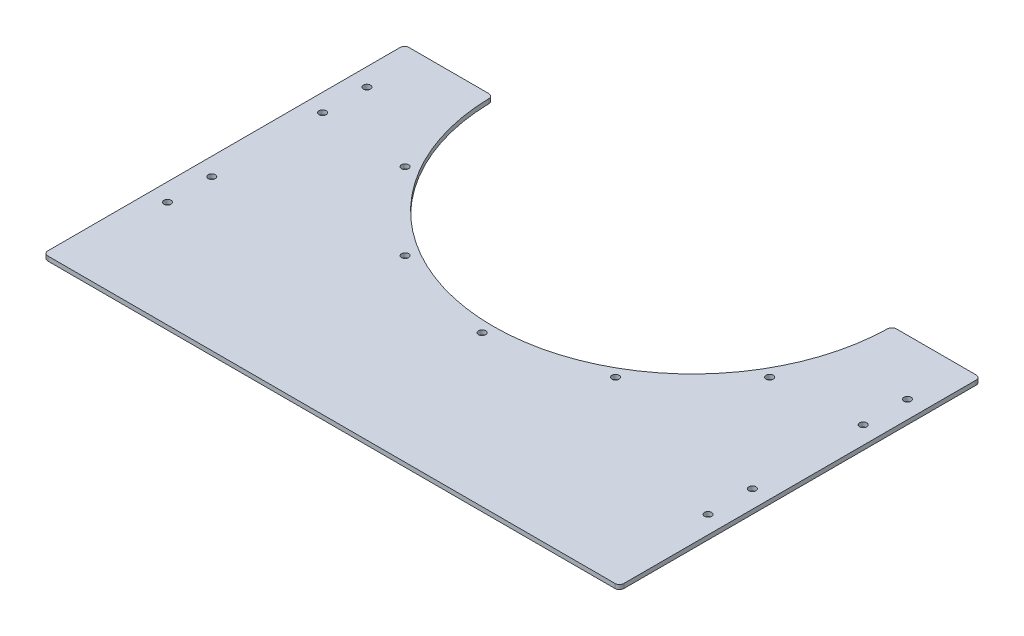
ISO-10303-21;
HEADER;
FILE_DESCRIPTION(('STEP AP214'),'2;1');
FILE_NAME('part.step','',(''),(''),'','','');
FILE_SCHEMA(('AUTOMOTIVE_DESIGN { 1 0 10303 214 1 1 1 1 }'));
ENDSEC;
DATA;
#1=APPLICATION_CONTEXT('core data for automotive mechanical design processes');
#2=APPLICATION_PROTOCOL_DEFINITION('international standard','automotive_design',2000,#1);
#3=PRODUCT_CONTEXT('',#1,'mechanical');
#4=PRODUCT('Part','Part','',(#3));
#5=PRODUCT_RELATED_PRODUCT_CATEGORY('part','',(#4));
#6=PRODUCT_DEFINITION_FORMATION('','',#4);
#7=PRODUCT_DEFINITION_CONTEXT('part definition',#1,'design');
#8=PRODUCT_DEFINITION('design','',#6,#7);
#9=PRODUCT_DEFINITION_SHAPE('','',#8);
#10=(LENGTH_UNIT() NAMED_UNIT(*) SI_UNIT(.MILLI.,.METRE.));
#11=(NAMED_UNIT(*) PLANE_ANGLE_UNIT() SI_UNIT($,.RADIAN.));
#12=(NAMED_UNIT(*) SI_UNIT($,.STERADIAN.) SOLID_ANGLE_UNIT());
#13=UNCERTAINTY_MEASURE_WITH_UNIT(LENGTH_MEASURE(1.E-05),#10,'distance_accuracy_value','');
#14=(GEOMETRIC_REPRESENTATION_CONTEXT(3) GLOBAL_UNCERTAINTY_ASSIGNED_CONTEXT((#13)) GLOBAL_UNIT_ASSIGNED_CONTEXT((#10,
#11,#12)) REPRESENTATION_CONTEXT('',''));
#15=CARTESIAN_POINT('',(0.,0.,0.));
#16=DIRECTION('',(0.,0.,1.));
#17=DIRECTION('',(1.,0.,0.));
#18=AXIS2_PLACEMENT_3D('',#15,#16,#17);
#19=CARTESIAN_POINT('',(0.,2.,-81.5000000000001));
#20=DIRECTION('',(0.,-1.,0.));
#21=DIRECTION('',(0.,0.,-1.));
#22=AXIS2_PLACEMENT_3D('',#19,#20,#21);
#23=CYLINDRICAL_SURFACE('',#22,90.);
#24=CARTESIAN_POINT('',(0.,2.,-81.5000000000001));
#25=DIRECTION('',(0.,1.,0.));
#26=DIRECTION('',(0.,0.,1.));
#27=AXIS2_PLACEMENT_3D('',#24,#25,#26);
#28=CIRCLE('',#27,90.);
#29=CARTESIAN_POINT('',(-89.9787309461759,2.,-79.5434782608696));
#30=VERTEX_POINT('',#29);
#31=CARTESIAN_POINT('',(89.9787309461759,2.,-79.5434782608696));
#32=VERTEX_POINT('',#31);
#33=EDGE_CURVE('E212',#30,#32,#28,.T.);
#34=ORIENTED_EDGE('',*,*,#33,.T.);
#35=DIRECTION('',(0.,-1.,0.));
#36=VECTOR('',#35,1.);
#37=CARTESIAN_POINT('',(89.9787309461759,2.,-79.5434782608696));
#38=LINE('',#37,#36);
#39=CARTESIAN_POINT('',(89.9787309461759,0.,-79.5434782608696));
#40=VERTEX_POINT('',#39);
#41=EDGE_CURVE('E146',#32,#40,#38,.T.);
#42=ORIENTED_EDGE('',*,*,#41,.T.);
#43=CARTESIAN_POINT('',(0.,0.,-81.5000000000001));
#44=DIRECTION('',(0.,1.,0.));
#45=DIRECTION('',(0.,0.,1.));
#46=AXIS2_PLACEMENT_3D('',#43,#44,#45);
#47=CIRCLE('',#46,90.);
#48=CARTESIAN_POINT('',(-89.9787309461759,0.,-79.5434782608696));
#49=VERTEX_POINT('',#48);
#50=EDGE_CURVE('E131',#49,#40,#47,.T.);
#51=ORIENTED_EDGE('',*,*,#50,.F.);
#52=DIRECTION('',(0.,-1.,0.));
#53=VECTOR('',#52,1.);
#54=CARTESIAN_POINT('',(-89.9787309461759,2.,-79.5434782608696));
#55=LINE('',#54,#53);
#56=EDGE_CURVE('E143',#49,#30,#55,.F.);
#57=ORIENTED_EDGE('',*,*,#56,.T.);
#58=EDGE_LOOP('',(#34,#42,#51,#57));
#59=FACE_BOUND('',#58,.T.);
#60=ADVANCED_FACE('F36',(#59),#23,.F.);
#61=CARTESIAN_POINT('',(0.,2.,-81.5));
#62=DIRECTION('',(0.,0.,1.));
#63=DIRECTION('',(1.,0.,0.));
#64=AXIS2_PLACEMENT_3D('',#61,#62,#63);
#65=PLANE('',#64);
#66=DIRECTION('',(-1.,0.,0.));
#67=VECTOR('',#66,1.);
#68=CARTESIAN_POINT('',(0.,2.,-81.5));
#69=LINE('',#68,#67);
#70=CARTESIAN_POINT('',(-91.9782583005354,2.,-81.5));
#71=VERTEX_POINT('',#70);
#72=CARTESIAN_POINT('',(-128.,2.,-81.5));
#73=VERTEX_POINT('',#72);
#74=EDGE_CURVE('E203',#71,#73,#69,.T.);
#75=ORIENTED_EDGE('',*,*,#74,.F.);
#76=DIRECTION('',(0.,1.,0.));
#77=VECTOR('',#76,1.);
#78=CARTESIAN_POINT('',(-91.9782583005354,0.,-81.5));
#79=LINE('',#78,#77);
#80=CARTESIAN_POINT('',(-91.9782583005354,0.,-81.5));
#81=VERTEX_POINT('',#80);
#82=EDGE_CURVE('E11',#71,#81,#79,.F.);
#83=ORIENTED_EDGE('',*,*,#82,.T.);
#84=DIRECTION('',(-1.,0.,0.));
#85=VECTOR('',#84,1.);
#86=CARTESIAN_POINT('',(0.,0.,-81.5));
#87=LINE('',#86,#85);
#88=CARTESIAN_POINT('',(-128.,0.,-81.5));
#89=VERTEX_POINT('',#88);
#90=EDGE_CURVE('E133',#81,#89,#87,.T.);
#91=ORIENTED_EDGE('',*,*,#90,.T.);
#92=DIRECTION('',(0.,-1.,0.));
#93=VECTOR('',#92,1.);
#94=CARTESIAN_POINT('',(-128.,2.,-81.5));
#95=LINE('',#94,#93);
#96=EDGE_CURVE('E44',#89,#73,#95,.F.);
#97=ORIENTED_EDGE('',*,*,#96,.T.);
#98=EDGE_LOOP('',(#75,#83,#91,#97));
#99=FACE_BOUND('',#98,.T.);
#100=ADVANCED_FACE('F202',(#99),#65,.F.);
#101=CARTESIAN_POINT('',(-130.,2.,0.));
#102=DIRECTION('',(-1.,0.,0.));
#103=DIRECTION('',(0.,0.,1.));
#104=AXIS2_PLACEMENT_3D('',#101,#102,#103);
#105=PLANE('',#104);
#106=DIRECTION('',(0.,0.,-1.));
#107=VECTOR('',#106,1.);
#108=CARTESIAN_POINT('',(-130.,0.,0.));
#109=LINE('',#108,#107);
#110=CARTESIAN_POINT('',(-130.,0.,79.5));
#111=VERTEX_POINT('',#110);
#112=CARTESIAN_POINT('',(-130.,0.,-79.5));
#113=VERTEX_POINT('',#112);
#114=EDGE_CURVE('E220',#111,#113,#109,.T.);
#115=ORIENTED_EDGE('',*,*,#114,.F.);
#116=DIRECTION('',(0.,-1.,0.));
#117=VECTOR('',#116,1.);
#118=CARTESIAN_POINT('',(-130.,2.,79.5));
#119=LINE('',#118,#117);
#120=CARTESIAN_POINT('',(-130.,2.,79.5));
#121=VERTEX_POINT('',#120);
#122=EDGE_CURVE('E197',#111,#121,#119,.F.);
#123=ORIENTED_EDGE('',*,*,#122,.T.);
#124=DIRECTION('',(0.,0.,-1.));
#125=VECTOR('',#124,1.);
#126=CARTESIAN_POINT('',(-130.,2.,0.));
#127=LINE('',#126,#125);
#128=CARTESIAN_POINT('',(-130.,2.,-79.5));
#129=VERTEX_POINT('',#128);
#130=EDGE_CURVE('E211',#121,#129,#127,.T.);
#131=ORIENTED_EDGE('',*,*,#130,.T.);
#132=DIRECTION('',(0.,-1.,0.));
#133=VECTOR('',#132,1.);
#134=CARTESIAN_POINT('',(-130.,0.,-79.5));
#135=LINE('',#134,#133);
#136=EDGE_CURVE('E194',#129,#113,#135,.T.);
#137=ORIENTED_EDGE('',*,*,#136,.T.);
#138=EDGE_LOOP('',(#115,#123,#131,#137));
#139=FACE_BOUND('',#138,.T.);
#140=ADVANCED_FACE('F219',(#139),#105,.T.);
#141=CARTESIAN_POINT('',(0.,2.,81.5));
#142=DIRECTION('',(0.,0.,1.));
#143=DIRECTION('',(1.,0.,0.));
#144=AXIS2_PLACEMENT_3D('',#141,#142,#143);
#145=PLANE('',#144);
#146=DIRECTION('',(-1.,0.,0.));
#147=VECTOR('',#146,1.);
#148=CARTESIAN_POINT('',(0.,0.,81.5));
#149=LINE('',#148,#147);
#150=CARTESIAN_POINT('',(128.,0.,81.5));
#151=VERTEX_POINT('',#150);
#152=CARTESIAN_POINT('',(-128.,0.,81.5));
#153=VERTEX_POINT('',#152);
#154=EDGE_CURVE('E223',#151,#153,#149,.T.);
#155=ORIENTED_EDGE('',*,*,#154,.F.);
#156=DIRECTION('',(0.,-1.,0.));
#157=VECTOR('',#156,1.);
#158=CARTESIAN_POINT('',(128.,2.,81.5));
#159=LINE('',#158,#157);
#160=CARTESIAN_POINT('',(128.,2.,81.5));
#161=VERTEX_POINT('',#160);
#162=EDGE_CURVE('E192',#151,#161,#159,.F.);
#163=ORIENTED_EDGE('',*,*,#162,.T.);
#164=DIRECTION('',(-1.,0.,0.));
#165=VECTOR('',#164,1.);
#166=CARTESIAN_POINT('',(0.,2.,81.5));
#167=LINE('',#166,#165);
#168=CARTESIAN_POINT('',(-128.,2.,81.5));
#169=VERTEX_POINT('',#168);
#170=EDGE_CURVE('E254',#161,#169,#167,.T.);
#171=ORIENTED_EDGE('',*,*,#170,.T.);
#172=DIRECTION('',(0.,-1.,0.));
#173=VECTOR('',#172,1.);
#174=CARTESIAN_POINT('',(-128.,2.,81.5));
#175=LINE('',#174,#173);
#176=EDGE_CURVE('E189',#169,#153,#175,.T.);
#177=ORIENTED_EDGE('',*,*,#176,.T.);
#178=EDGE_LOOP('',(#155,#163,#171,#177));
#179=FACE_BOUND('',#178,.T.);
#180=ADVANCED_FACE('F317',(#179),#145,.T.);
#181=CARTESIAN_POINT('',(130.,2.,0.));
#182=DIRECTION('',(-1.,0.,0.));
#183=DIRECTION('',(0.,0.,1.));
#184=AXIS2_PLACEMENT_3D('',#181,#182,#183);
#185=PLANE('',#184);
#186=DIRECTION('',(0.,0.,-1.));
#187=VECTOR('',#186,1.);
#188=CARTESIAN_POINT('',(130.,0.,0.));
#189=LINE('',#188,#187);
#190=CARTESIAN_POINT('',(130.,0.,79.5));
#191=VERTEX_POINT('',#190);
#192=CARTESIAN_POINT('',(130.,0.,-79.5));
#193=VERTEX_POINT('',#192);
#194=EDGE_CURVE('E225',#191,#193,#189,.T.);
#195=ORIENTED_EDGE('',*,*,#194,.T.);
#196=DIRECTION('',(0.,-1.,0.));
#197=VECTOR('',#196,1.);
#198=CARTESIAN_POINT('',(130.,2.,-79.5));
#199=LINE('',#198,#197);
#200=CARTESIAN_POINT('',(130.,2.,-79.5));
#201=VERTEX_POINT('',#200);
#202=EDGE_CURVE('E51',#193,#201,#199,.F.);
#203=ORIENTED_EDGE('',*,*,#202,.T.);
#204=DIRECTION('',(0.,0.,-1.));
#205=VECTOR('',#204,1.);
#206=CARTESIAN_POINT('',(130.,2.,0.));
#207=LINE('',#206,#205);
#208=CARTESIAN_POINT('',(130.,2.,79.5));
#209=VERTEX_POINT('',#208);
#210=EDGE_CURVE('E257',#209,#201,#207,.T.);
#211=ORIENTED_EDGE('',*,*,#210,.F.);
#212=DIRECTION('',(0.,-1.,0.));
#213=VECTOR('',#212,1.);
#214=CARTESIAN_POINT('',(130.,0.,79.5));
#215=LINE('',#214,#213);
#216=EDGE_CURVE('E185',#209,#191,#215,.T.);
#217=ORIENTED_EDGE('',*,*,#216,.T.);
#218=EDGE_LOOP('',(#195,#203,#211,#217));
#219=FACE_BOUND('',#218,.T.);
#220=ADVANCED_FACE('F320',(#219),#185,.F.);
#221=CARTESIAN_POINT('',(122.,2.,13.5));
#222=DIRECTION('',(0.,-1.,0.));
#223=DIRECTION('',(0.,0.,-1.));
#224=AXIS2_PLACEMENT_3D('',#221,#222,#223);
#225=CYLINDRICAL_SURFACE('',#224,1.6);
#226=CARTESIAN_POINT('',(122.,2.,13.5));
#227=DIRECTION('',(0.,1.,0.));
#228=DIRECTION('',(0.,0.,1.));
#229=AXIS2_PLACEMENT_3D('',#226,#227,#228);
#230=CIRCLE('',#229,1.6);
#231=CARTESIAN_POINT('',(122.,2.,15.1));
#232=VERTEX_POINT('',#231);
#233=EDGE_CURVE('E156',#232,#232,#230,.F.);
#234=ORIENTED_EDGE('',*,*,#233,.F.);
#235=EDGE_LOOP('',(#234));
#236=FACE_BOUND('',#235,.T.);
#237=CARTESIAN_POINT('',(122.,0.,13.5));
#238=DIRECTION('',(0.,1.,0.));
#239=DIRECTION('',(0.,0.,1.));
#240=AXIS2_PLACEMENT_3D('',#237,#238,#239);
#241=CIRCLE('',#240,1.6);
#242=CARTESIAN_POINT('',(122.,0.,15.1));
#243=VERTEX_POINT('',#242);
#244=EDGE_CURVE('E230',#243,#243,#241,.F.);
#245=ORIENTED_EDGE('',*,*,#244,.T.);
#246=EDGE_LOOP('',(#245));
#247=FACE_BOUND('',#246,.T.);
#248=ADVANCED_FACE('F307',(#236,#247),#225,.F.);
#249=CARTESIAN_POINT('',(128.,0.,-81.5));
#250=VERTEX_POINT('',#249);
#251=CARTESIAN_POINT('',(91.9782583005354,0.,-81.5));
#252=VERTEX_POINT('',#251);
#253=EDGE_CURVE('E228',#250,#252,#87,.T.);
#254=ORIENTED_EDGE('',*,*,#253,.T.);
#255=DIRECTION('',(0.,1.,0.));
#256=VECTOR('',#255,1.);
#257=CARTESIAN_POINT('',(91.9782583005354,2.,-81.5));
#258=LINE('',#257,#256);
#259=CARTESIAN_POINT('',(91.9782583005354,2.,-81.5));
#260=VERTEX_POINT('',#259);
#261=EDGE_CURVE('E173',#252,#260,#258,.T.);
#262=ORIENTED_EDGE('',*,*,#261,.T.);
#263=CARTESIAN_POINT('',(128.,2.,-81.5));
#264=VERTEX_POINT('',#263);
#265=EDGE_CURVE('E214',#264,#260,#69,.T.);
#266=ORIENTED_EDGE('',*,*,#265,.F.);
#267=DIRECTION('',(0.,-1.,0.));
#268=VECTOR('',#267,1.);
#269=CARTESIAN_POINT('',(128.,2.,-81.5));
#270=LINE('',#269,#268);
#271=EDGE_CURVE('E170',#264,#250,#270,.T.);
#272=ORIENTED_EDGE('',*,*,#271,.T.);
#273=EDGE_LOOP('',(#254,#262,#266,#272));
#274=FACE_BOUND('',#273,.T.);
#275=ADVANCED_FACE('F240',(#274),#65,.F.);
#276=CARTESIAN_POINT('',(-122.,2.,33.5));
#277=DIRECTION('',(0.,-1.,0.));
#278=DIRECTION('',(0.,0.,-1.));
#279=AXIS2_PLACEMENT_3D('',#276,#277,#278);
#280=CYLINDRICAL_SURFACE('',#279,1.60000000000001);
#281=CARTESIAN_POINT('',(-122.,2.,33.5));
#282=DIRECTION('',(0.,1.,0.));
#283=DIRECTION('',(0.,0.,1.));
#284=AXIS2_PLACEMENT_3D('',#281,#282,#283);
#285=CIRCLE('',#284,1.60000000000001);
#286=CARTESIAN_POINT('',(-122.,2.,35.1));
#287=VERTEX_POINT('',#286);
#288=EDGE_CURVE('E246',#287,#287,#285,.T.);
#289=ORIENTED_EDGE('',*,*,#288,.T.);
#290=EDGE_LOOP('',(#289));
#291=FACE_BOUND('',#290,.T.);
#292=CARTESIAN_POINT('',(-122.,0.,33.5));
#293=DIRECTION('',(0.,1.,0.));
#294=DIRECTION('',(0.,0.,1.));
#295=AXIS2_PLACEMENT_3D('',#292,#293,#294);
#296=CIRCLE('',#295,1.60000000000001);
#297=CARTESIAN_POINT('',(-122.,0.,35.1));
#298=VERTEX_POINT('',#297);
#299=EDGE_CURVE('E147',#298,#298,#296,.T.);
#300=ORIENTED_EDGE('',*,*,#299,.F.);
#301=EDGE_LOOP('',(#300));
#302=FACE_BOUND('',#301,.T.);
#303=ADVANCED_FACE('F295',(#291,#302),#280,.F.);
#304=CARTESIAN_POINT('',(-122.,2.,13.5));
#305=DIRECTION('',(0.,-1.,0.));
#306=DIRECTION('',(0.,0.,-1.));
#307=AXIS2_PLACEMENT_3D('',#304,#305,#306);
#308=CYLINDRICAL_SURFACE('',#307,1.6);
#309=CARTESIAN_POINT('',(-122.,2.,13.5));
#310=DIRECTION('',(0.,1.,0.));
#311=DIRECTION('',(0.,0.,1.));
#312=AXIS2_PLACEMENT_3D('',#309,#310,#311);
#313=CIRCLE('',#312,1.6);
#314=CARTESIAN_POINT('',(-122.,2.,15.1));
#315=VERTEX_POINT('',#314);
#316=EDGE_CURVE('E249',#315,#315,#313,.T.);
#317=ORIENTED_EDGE('',*,*,#316,.T.);
#318=EDGE_LOOP('',(#317));
#319=FACE_BOUND('',#318,.T.);
#320=CARTESIAN_POINT('',(-122.,0.,13.5));
#321=DIRECTION('',(0.,1.,0.));
#322=DIRECTION('',(0.,0.,1.));
#323=AXIS2_PLACEMENT_3D('',#320,#321,#322);
#324=CIRCLE('',#323,1.6);
#325=CARTESIAN_POINT('',(-122.,0.,15.1));
#326=VERTEX_POINT('',#325);
#327=EDGE_CURVE('E288',#326,#326,#324,.T.);
#328=ORIENTED_EDGE('',*,*,#327,.F.);
#329=EDGE_LOOP('',(#328));
#330=FACE_BOUND('',#329,.T.);
#331=ADVANCED_FACE('F297',(#319,#330),#308,.F.);
#332=CARTESIAN_POINT('',(-122.,2.,-36.5));
#333=DIRECTION('',(0.,-1.,0.));
#334=DIRECTION('',(0.,0.,-1.));
#335=AXIS2_PLACEMENT_3D('',#332,#333,#334);
#336=CYLINDRICAL_SURFACE('',#335,1.60000000000001);
#337=CARTESIAN_POINT('',(-122.,2.,-36.5));
#338=DIRECTION('',(0.,1.,0.));
#339=DIRECTION('',(0.,0.,1.));
#340=AXIS2_PLACEMENT_3D('',#337,#338,#339);
#341=CIRCLE('',#340,1.60000000000001);
#342=CARTESIAN_POINT('',(-122.,2.,-34.9));
#343=VERTEX_POINT('',#342);
#344=EDGE_CURVE('E373',#343,#343,#341,.T.);
#345=ORIENTED_EDGE('',*,*,#344,.T.);
#346=EDGE_LOOP('',(#345));
#347=FACE_BOUND('',#346,.T.);
#348=CARTESIAN_POINT('',(-122.,0.,-36.5));
#349=DIRECTION('',(0.,1.,0.));
#350=DIRECTION('',(0.,0.,1.));
#351=AXIS2_PLACEMENT_3D('',#348,#349,#350);
#352=CIRCLE('',#351,1.60000000000001);
#353=CARTESIAN_POINT('',(-122.,0.,-34.9));
#354=VERTEX_POINT('',#353);
#355=EDGE_CURVE('E285',#354,#354,#352,.T.);
#356=ORIENTED_EDGE('',*,*,#355,.F.);
#357=EDGE_LOOP('',(#356));
#358=FACE_BOUND('',#357,.T.);
#359=ADVANCED_FACE('F304',(#347,#358),#336,.F.);
#360=CARTESIAN_POINT('',(-122.,2.,-56.5));
#361=DIRECTION('',(0.,-1.,0.));
#362=DIRECTION('',(0.,0.,-1.));
#363=AXIS2_PLACEMENT_3D('',#360,#361,#362);
#364=CYLINDRICAL_SURFACE('',#363,1.60000000000001);
#365=CARTESIAN_POINT('',(-122.,2.,-56.5));
#366=DIRECTION('',(0.,1.,0.));
#367=DIRECTION('',(0.,0.,1.));
#368=AXIS2_PLACEMENT_3D('',#365,#366,#367);
#369=CIRCLE('',#368,1.60000000000001);
#370=CARTESIAN_POINT('',(-122.,2.,-54.9));
#371=VERTEX_POINT('',#370);
#372=EDGE_CURVE('E369',#371,#371,#369,.T.);
#373=ORIENTED_EDGE('',*,*,#372,.T.);
#374=EDGE_LOOP('',(#373));
#375=FACE_BOUND('',#374,.T.);
#376=CARTESIAN_POINT('',(-122.,0.,-56.5));
#377=DIRECTION('',(0.,1.,0.));
#378=DIRECTION('',(0.,0.,1.));
#379=AXIS2_PLACEMENT_3D('',#376,#377,#378);
#380=CIRCLE('',#379,1.60000000000001);
#381=CARTESIAN_POINT('',(-122.,0.,-54.9));
#382=VERTEX_POINT('',#381);
#383=EDGE_CURVE('E282',#382,#382,#380,.T.);
#384=ORIENTED_EDGE('',*,*,#383,.F.);
#385=EDGE_LOOP('',(#384));
#386=FACE_BOUND('',#385,.T.);
#387=ADVANCED_FACE('F414',(#375,#386),#364,.F.);
#388=CARTESIAN_POINT('',(122.,2.,33.5));
#389=DIRECTION('',(0.,-1.,0.));
#390=DIRECTION('',(0.,0.,-1.));
#391=AXIS2_PLACEMENT_3D('',#388,#389,#390);
#392=CYLINDRICAL_SURFACE('',#391,1.60000000000001);
#393=CARTESIAN_POINT('',(122.,2.,33.5));
#394=DIRECTION('',(0.,1.,0.));
#395=DIRECTION('',(0.,0.,1.));
#396=AXIS2_PLACEMENT_3D('',#393,#394,#395);
#397=CIRCLE('',#396,1.60000000000001);
#398=CARTESIAN_POINT('',(122.,2.,35.1));
#399=VERTEX_POINT('',#398);
#400=EDGE_CURVE('E365',#399,#399,#397,.F.);
#401=ORIENTED_EDGE('',*,*,#400,.F.);
#402=EDGE_LOOP('',(#401));
#403=FACE_BOUND('',#402,.T.);
#404=CARTESIAN_POINT('',(122.,0.,33.5));
#405=DIRECTION('',(0.,1.,0.));
#406=DIRECTION('',(0.,0.,1.));
#407=AXIS2_PLACEMENT_3D('',#404,#405,#406);
#408=CIRCLE('',#407,1.60000000000001);
#409=CARTESIAN_POINT('',(122.,0.,35.1));
#410=VERTEX_POINT('',#409);
#411=EDGE_CURVE('E279',#410,#410,#408,.F.);
#412=ORIENTED_EDGE('',*,*,#411,.T.);
#413=EDGE_LOOP('',(#412));
#414=FACE_BOUND('',#413,.T.);
#415=ADVANCED_FACE('F420',(#403,#414),#392,.F.);
#416=CARTESIAN_POINT('',(122.,2.,-36.5));
#417=DIRECTION('',(0.,-1.,0.));
#418=DIRECTION('',(0.,0.,-1.));
#419=AXIS2_PLACEMENT_3D('',#416,#417,#418);
#420=CYLINDRICAL_SURFACE('',#419,1.60000000000001);
#421=CARTESIAN_POINT('',(122.,2.,-36.5));
#422=DIRECTION('',(0.,1.,0.));
#423=DIRECTION('',(0.,0.,1.));
#424=AXIS2_PLACEMENT_3D('',#421,#422,#423);
#425=CIRCLE('',#424,1.60000000000001);
#426=CARTESIAN_POINT('',(122.,2.,-34.9));
#427=VERTEX_POINT('',#426);
#428=EDGE_CURVE('E361',#427,#427,#425,.F.);
#429=ORIENTED_EDGE('',*,*,#428,.F.);
#430=EDGE_LOOP('',(#429));
#431=FACE_BOUND('',#430,.T.);
#432=CARTESIAN_POINT('',(122.,0.,-36.5));
#433=DIRECTION('',(0.,1.,0.));
#434=DIRECTION('',(0.,0.,1.));
#435=AXIS2_PLACEMENT_3D('',#432,#433,#434);
#436=CIRCLE('',#435,1.60000000000001);
#437=CARTESIAN_POINT('',(122.,0.,-34.9));
#438=VERTEX_POINT('',#437);
#439=EDGE_CURVE('E276',#438,#438,#436,.F.);
#440=ORIENTED_EDGE('',*,*,#439,.T.);
#441=EDGE_LOOP('',(#440));
#442=FACE_BOUND('',#441,.T.);
#443=ADVANCED_FACE('F426',(#431,#442),#420,.F.);
#444=CARTESIAN_POINT('',(82.2724133595255,2.,-34.000000000002));
#445=DIRECTION('',(0.,-1.,0.));
#446=DIRECTION('',(0.,0.,-1.));
#447=AXIS2_PLACEMENT_3D('',#444,#445,#446);
#448=CYLINDRICAL_SURFACE('',#447,1.6);
#449=CARTESIAN_POINT('',(82.2724133595255,2.,-34.000000000002));
#450=DIRECTION('',(0.,1.,0.));
#451=DIRECTION('',(0.,0.,1.));
#452=AXIS2_PLACEMENT_3D('',#449,#450,#451);
#453=CIRCLE('',#452,1.6);
#454=CARTESIAN_POINT('',(82.2724133595255,2.,-32.400000000002));
#455=VERTEX_POINT('',#454);
#456=EDGE_CURVE('E357',#455,#455,#453,.T.);
#457=ORIENTED_EDGE('',*,*,#456,.T.);
#458=EDGE_LOOP('',(#457));
#459=FACE_BOUND('',#458,.T.);
#460=CARTESIAN_POINT('',(82.2724133595255,0.,-34.000000000002));
#461=DIRECTION('',(0.,1.,0.));
#462=DIRECTION('',(0.,0.,1.));
#463=AXIS2_PLACEMENT_3D('',#460,#461,#462);
#464=CIRCLE('',#463,1.6);
#465=CARTESIAN_POINT('',(82.2724133595255,0.,-32.400000000002));
#466=VERTEX_POINT('',#465);
#467=EDGE_CURVE('E273',#466,#466,#464,.T.);
#468=ORIENTED_EDGE('',*,*,#467,.F.);
#469=EDGE_LOOP('',(#468));
#470=FACE_BOUND('',#469,.T.);
#471=ADVANCED_FACE('F430',(#459,#470),#448,.F.);
#472=CARTESIAN_POINT('',(47.5000000000046,2.,0.772413359520524));
#473=DIRECTION('',(0.,-1.,0.));
#474=DIRECTION('',(0.,0.,-1.));
#475=AXIS2_PLACEMENT_3D('',#472,#473,#474);
#476=CYLINDRICAL_SURFACE('',#475,1.60000000000002);
#477=CARTESIAN_POINT('',(47.5000000000046,2.,0.772413359520524));
#478=DIRECTION('',(0.,1.,0.));
#479=DIRECTION('',(0.,0.,1.));
#480=AXIS2_PLACEMENT_3D('',#477,#478,#479);
#481=CIRCLE('',#480,1.60000000000002);
#482=CARTESIAN_POINT('',(47.5000000000046,2.,2.37241335952055));
#483=VERTEX_POINT('',#482);
#484=EDGE_CURVE('E353',#483,#483,#481,.T.);
#485=ORIENTED_EDGE('',*,*,#484,.T.);
#486=EDGE_LOOP('',(#485));
#487=FACE_BOUND('',#486,.T.);
#488=CARTESIAN_POINT('',(47.5000000000046,0.,0.772413359520524));
#489=DIRECTION('',(0.,1.,0.));
#490=DIRECTION('',(0.,0.,1.));
#491=AXIS2_PLACEMENT_3D('',#488,#489,#490);
#492=CIRCLE('',#491,1.60000000000002);
#493=CARTESIAN_POINT('',(47.5000000000046,0.,2.37241335952055));
#494=VERTEX_POINT('',#493);
#495=EDGE_CURVE('E270',#494,#494,#492,.T.);
#496=ORIENTED_EDGE('',*,*,#495,.F.);
#497=EDGE_LOOP('',(#496));
#498=FACE_BOUND('',#497,.T.);
#499=ADVANCED_FACE('F434',(#487,#498),#476,.F.);
#500=CARTESIAN_POINT('',(4.7009792771229E-12,2.,13.5));
#501=DIRECTION('',(0.,-1.,0.));
#502=DIRECTION('',(0.,0.,-1.));
#503=AXIS2_PLACEMENT_3D('',#500,#501,#502);
#504=CYLINDRICAL_SURFACE('',#503,1.6);
#505=CARTESIAN_POINT('',(4.7009792771229E-12,2.,13.5));
#506=DIRECTION('',(0.,1.,0.));
#507=DIRECTION('',(0.,0.,1.));
#508=AXIS2_PLACEMENT_3D('',#505,#506,#507);
#509=CIRCLE('',#508,1.6);
#510=CARTESIAN_POINT('',(4.7009792771229E-12,2.,15.1));
#511=VERTEX_POINT('',#510);
#512=EDGE_CURVE('E349',#511,#511,#509,.T.);
#513=ORIENTED_EDGE('',*,*,#512,.T.);
#514=EDGE_LOOP('',(#513));
#515=FACE_BOUND('',#514,.T.);
#516=CARTESIAN_POINT('',(4.7009792771229E-12,0.,13.5));
#517=DIRECTION('',(0.,1.,0.));
#518=DIRECTION('',(0.,0.,1.));
#519=AXIS2_PLACEMENT_3D('',#516,#517,#518);
#520=CIRCLE('',#519,1.6);
#521=CARTESIAN_POINT('',(4.7009792771229E-12,0.,15.1));
#522=VERTEX_POINT('',#521);
#523=EDGE_CURVE('E267',#522,#522,#520,.T.);
#524=ORIENTED_EDGE('',*,*,#523,.F.);
#525=EDGE_LOOP('',(#524));
#526=FACE_BOUND('',#525,.T.);
#527=ADVANCED_FACE('F438',(#515,#526),#504,.F.);
#528=CARTESIAN_POINT('',(-47.4999999999957,2.,0.772413359522578));
#529=DIRECTION('',(0.,-1.,0.));
#530=DIRECTION('',(0.,0.,-1.));
#531=AXIS2_PLACEMENT_3D('',#528,#529,#530);
#532=CYLINDRICAL_SURFACE('',#531,1.6);
#533=CARTESIAN_POINT('',(-47.4999999999957,2.,0.772413359522578));
#534=DIRECTION('',(0.,1.,0.));
#535=DIRECTION('',(0.,0.,1.));
#536=AXIS2_PLACEMENT_3D('',#533,#534,#535);
#537=CIRCLE('',#536,1.6);
#538=CARTESIAN_POINT('',(-47.4999999999957,2.,2.37241335952258));
#539=VERTEX_POINT('',#538);
#540=EDGE_CURVE('E345',#539,#539,#537,.T.);
#541=ORIENTED_EDGE('',*,*,#540,.T.);
#542=EDGE_LOOP('',(#541));
#543=FACE_BOUND('',#542,.T.);
#544=CARTESIAN_POINT('',(-47.4999999999957,0.,0.772413359522578));
#545=DIRECTION('',(0.,1.,0.));
#546=DIRECTION('',(0.,0.,1.));
#547=AXIS2_PLACEMENT_3D('',#544,#545,#546);
#548=CIRCLE('',#547,1.6);
#549=CARTESIAN_POINT('',(-47.4999999999957,0.,2.37241335952258));
#550=VERTEX_POINT('',#549);
#551=EDGE_CURVE('E264',#550,#550,#548,.T.);
#552=ORIENTED_EDGE('',*,*,#551,.F.);
#553=EDGE_LOOP('',(#552));
#554=FACE_BOUND('',#553,.T.);
#555=ADVANCED_FACE('F390',(#543,#554),#532,.F.);
#556=CARTESIAN_POINT('',(-82.2724133595181,2.,-33.9999999999985));
#557=DIRECTION('',(0.,-1.,0.));
#558=DIRECTION('',(0.,0.,-1.));
#559=AXIS2_PLACEMENT_3D('',#556,#557,#558);
#560=CYLINDRICAL_SURFACE('',#559,1.59999999999999);
#561=CARTESIAN_POINT('',(-82.2724133595181,2.,-33.9999999999985));
#562=DIRECTION('',(0.,1.,0.));
#563=DIRECTION('',(0.,0.,1.));
#564=AXIS2_PLACEMENT_3D('',#561,#562,#563);
#565=CIRCLE('',#564,1.59999999999999);
#566=CARTESIAN_POINT('',(-82.2724133595181,2.,-32.3999999999985));
#567=VERTEX_POINT('',#566);
#568=EDGE_CURVE('E235',#567,#567,#565,.T.);
#569=ORIENTED_EDGE('',*,*,#568,.T.);
#570=EDGE_LOOP('',(#569));
#571=FACE_BOUND('',#570,.T.);
#572=CARTESIAN_POINT('',(-82.2724133595181,0.,-33.9999999999985));
#573=DIRECTION('',(0.,1.,0.));
#574=DIRECTION('',(0.,0.,1.));
#575=AXIS2_PLACEMENT_3D('',#572,#573,#574);
#576=CIRCLE('',#575,1.59999999999999);
#577=CARTESIAN_POINT('',(-82.2724133595181,0.,-32.3999999999985));
#578=VERTEX_POINT('',#577);
#579=EDGE_CURVE('E261',#578,#578,#576,.T.);
#580=ORIENTED_EDGE('',*,*,#579,.F.);
#581=EDGE_LOOP('',(#580));
#582=FACE_BOUND('',#581,.T.);
#583=ADVANCED_FACE('F330',(#571,#582),#560,.F.);
#584=CARTESIAN_POINT('',(122.,2.,-56.5));
#585=DIRECTION('',(0.,-1.,0.));
#586=DIRECTION('',(0.,0.,-1.));
#587=AXIS2_PLACEMENT_3D('',#584,#585,#586);
#588=CYLINDRICAL_SURFACE('',#587,1.60000000000001);
#589=CARTESIAN_POINT('',(122.,2.,-56.5));
#590=DIRECTION('',(0.,1.,0.));
#591=DIRECTION('',(0.,0.,1.));
#592=AXIS2_PLACEMENT_3D('',#589,#590,#591);
#593=CIRCLE('',#592,1.60000000000001);
#594=CARTESIAN_POINT('',(122.,2.,-54.9));
#595=VERTEX_POINT('',#594);
#596=EDGE_CURVE('E152',#595,#595,#593,.F.);
#597=ORIENTED_EDGE('',*,*,#596,.F.);
#598=EDGE_LOOP('',(#597));
#599=FACE_BOUND('',#598,.T.);
#600=CARTESIAN_POINT('',(122.,0.,-56.5));
#601=DIRECTION('',(0.,1.,0.));
#602=DIRECTION('',(0.,0.,1.));
#603=AXIS2_PLACEMENT_3D('',#600,#601,#602);
#604=CIRCLE('',#603,1.60000000000001);
#605=CARTESIAN_POINT('',(122.,0.,-54.9));
#606=VERTEX_POINT('',#605);
#607=EDGE_CURVE('E159',#606,#606,#604,.F.);
#608=ORIENTED_EDGE('',*,*,#607,.T.);
#609=EDGE_LOOP('',(#608));
#610=FACE_BOUND('',#609,.T.);
#611=ADVANCED_FACE('F327',(#599,#610),#588,.F.);
#612=CARTESIAN_POINT('',(0.,2.,0.));
#613=DIRECTION('',(0.,1.,0.));
#614=DIRECTION('',(0.,0.,1.));
#615=AXIS2_PLACEMENT_3D('',#612,#613,#614);
#616=PLANE('',#615);
#617=ORIENTED_EDGE('',*,*,#568,.F.);
#618=EDGE_LOOP('',(#617));
#619=FACE_BOUND('',#618,.T.);
#620=ORIENTED_EDGE('',*,*,#540,.F.);
#621=EDGE_LOOP('',(#620));
#622=FACE_BOUND('',#621,.T.);
#623=ORIENTED_EDGE('',*,*,#512,.F.);
#624=EDGE_LOOP('',(#623));
#625=FACE_BOUND('',#624,.T.);
#626=ORIENTED_EDGE('',*,*,#484,.F.);
#627=EDGE_LOOP('',(#626));
#628=FACE_BOUND('',#627,.T.);
#629=ORIENTED_EDGE('',*,*,#456,.F.);
#630=EDGE_LOOP('',(#629));
#631=FACE_BOUND('',#630,.T.);
#632=ORIENTED_EDGE('',*,*,#428,.T.);
#633=EDGE_LOOP('',(#632));
#634=FACE_BOUND('',#633,.T.);
#635=ORIENTED_EDGE('',*,*,#400,.T.);
#636=EDGE_LOOP('',(#635));
#637=FACE_BOUND('',#636,.T.);
#638=ORIENTED_EDGE('',*,*,#372,.F.);
#639=EDGE_LOOP('',(#638));
#640=FACE_BOUND('',#639,.T.);
#641=ORIENTED_EDGE('',*,*,#344,.F.);
#642=EDGE_LOOP('',(#641));
#643=FACE_BOUND('',#642,.T.);
#644=ORIENTED_EDGE('',*,*,#316,.F.);
#645=EDGE_LOOP('',(#644));
#646=FACE_BOUND('',#645,.T.);
#647=ORIENTED_EDGE('',*,*,#288,.F.);
#648=EDGE_LOOP('',(#647));
#649=FACE_BOUND('',#648,.T.);
#650=ORIENTED_EDGE('',*,*,#265,.T.);
#651=CARTESIAN_POINT('',(91.9782583005354,2.,-79.5));
#652=DIRECTION('',(0.,1.,0.));
#653=DIRECTION('',(0.,0.,1.));
#654=AXIS2_PLACEMENT_3D('',#651,#652,#653);
#655=CIRCLE('',#654,2.);
#656=EDGE_CURVE('E183',#260,#32,#655,.T.);
#657=ORIENTED_EDGE('',*,*,#656,.T.);
#658=ORIENTED_EDGE('',*,*,#33,.F.);
#659=CARTESIAN_POINT('',(-91.9782583005354,2.,-79.5));
#660=DIRECTION('',(0.,1.,0.));
#661=DIRECTION('',(0.,0.,1.));
#662=AXIS2_PLACEMENT_3D('',#659,#660,#661);
#663=CIRCLE('',#662,2.);
#664=EDGE_CURVE('E151',#30,#71,#663,.T.);
#665=ORIENTED_EDGE('',*,*,#664,.T.);
#666=ORIENTED_EDGE('',*,*,#74,.T.);
#667=CARTESIAN_POINT('',(-128.,2.,-79.5));
#668=DIRECTION('',(0.,1.,0.));
#669=DIRECTION('',(0.,0.,1.));
#670=AXIS2_PLACEMENT_3D('',#667,#668,#669);
#671=CIRCLE('',#670,2.);
#672=EDGE_CURVE('E175',#73,#129,#671,.T.);
#673=ORIENTED_EDGE('',*,*,#672,.T.);
#674=ORIENTED_EDGE('',*,*,#130,.F.);
#675=CARTESIAN_POINT('',(-128.,2.,79.5));
#676=DIRECTION('',(0.,1.,0.));
#677=DIRECTION('',(0.,0.,1.));
#678=AXIS2_PLACEMENT_3D('',#675,#676,#677);
#679=CIRCLE('',#678,2.);
#680=EDGE_CURVE('E178',#121,#169,#679,.T.);
#681=ORIENTED_EDGE('',*,*,#680,.T.);
#682=ORIENTED_EDGE('',*,*,#170,.F.);
#683=CARTESIAN_POINT('',(128.,2.,79.5));
#684=DIRECTION('',(0.,1.,0.));
#685=DIRECTION('',(0.,0.,1.));
#686=AXIS2_PLACEMENT_3D('',#683,#684,#685);
#687=CIRCLE('',#686,2.);
#688=EDGE_CURVE('E58',#161,#209,#687,.T.);
#689=ORIENTED_EDGE('',*,*,#688,.T.);
#690=ORIENTED_EDGE('',*,*,#210,.T.);
#691=CARTESIAN_POINT('',(128.,2.,-79.5));
#692=DIRECTION('',(0.,1.,0.));
#693=DIRECTION('',(0.,0.,1.));
#694=AXIS2_PLACEMENT_3D('',#691,#692,#693);
#695=CIRCLE('',#694,2.);
#696=EDGE_CURVE('E181',#201,#264,#695,.T.);
#697=ORIENTED_EDGE('',*,*,#696,.T.);
#698=EDGE_LOOP('',(#650,#657,#658,#665,#666,#673,#674,#681,#682,#689,#690,#697));
#699=FACE_BOUND('',#698,.T.);
#700=ORIENTED_EDGE('',*,*,#233,.T.);
#701=EDGE_LOOP('',(#700));
#702=FACE_BOUND('',#701,.T.);
#703=ORIENTED_EDGE('',*,*,#596,.T.);
#704=EDGE_LOOP('',(#703));
#705=FACE_BOUND('',#704,.T.);
#706=ADVANCED_FACE('F207',(#619,#622,#625,#628,#631,#634,#637,#640,#643,#646,#649,#699,#702,
#705),#616,.T.);
#707=CARTESIAN_POINT('',(0.,0.,0.));
#708=DIRECTION('',(0.,1.,0.));
#709=DIRECTION('',(0.,0.,1.));
#710=AXIS2_PLACEMENT_3D('',#707,#708,#709);
#711=PLANE('',#710);
#712=ORIENTED_EDGE('',*,*,#579,.T.);
#713=EDGE_LOOP('',(#712));
#714=FACE_BOUND('',#713,.T.);
#715=ORIENTED_EDGE('',*,*,#551,.T.);
#716=EDGE_LOOP('',(#715));
#717=FACE_BOUND('',#716,.T.);
#718=ORIENTED_EDGE('',*,*,#523,.T.);
#719=EDGE_LOOP('',(#718));
#720=FACE_BOUND('',#719,.T.);
#721=ORIENTED_EDGE('',*,*,#495,.T.);
#722=EDGE_LOOP('',(#721));
#723=FACE_BOUND('',#722,.T.);
#724=ORIENTED_EDGE('',*,*,#467,.T.);
#725=EDGE_LOOP('',(#724));
#726=FACE_BOUND('',#725,.T.);
#727=ORIENTED_EDGE('',*,*,#439,.F.);
#728=EDGE_LOOP('',(#727));
#729=FACE_BOUND('',#728,.T.);
#730=ORIENTED_EDGE('',*,*,#411,.F.);
#731=EDGE_LOOP('',(#730));
#732=FACE_BOUND('',#731,.T.);
#733=ORIENTED_EDGE('',*,*,#383,.T.);
#734=EDGE_LOOP('',(#733));
#735=FACE_BOUND('',#734,.T.);
#736=ORIENTED_EDGE('',*,*,#355,.T.);
#737=EDGE_LOOP('',(#736));
#738=FACE_BOUND('',#737,.T.);
#739=ORIENTED_EDGE('',*,*,#327,.T.);
#740=EDGE_LOOP('',(#739));
#741=FACE_BOUND('',#740,.T.);
#742=ORIENTED_EDGE('',*,*,#299,.T.);
#743=EDGE_LOOP('',(#742));
#744=FACE_BOUND('',#743,.T.);
#745=ORIENTED_EDGE('',*,*,#50,.T.);
#746=CARTESIAN_POINT('',(91.9782583005354,0.,-79.5));
#747=DIRECTION('',(0.,1.,0.));
#748=DIRECTION('',(0.,0.,1.));
#749=AXIS2_PLACEMENT_3D('',#746,#747,#748);
#750=CIRCLE('',#749,2.);
#751=EDGE_CURVE('E168',#40,#252,#750,.F.);
#752=ORIENTED_EDGE('',*,*,#751,.T.);
#753=ORIENTED_EDGE('',*,*,#253,.F.);
#754=CARTESIAN_POINT('',(128.,0.,-79.5));
#755=DIRECTION('',(0.,1.,0.));
#756=DIRECTION('',(0.,0.,1.));
#757=AXIS2_PLACEMENT_3D('',#754,#755,#756);
#758=CIRCLE('',#757,2.);
#759=EDGE_CURVE('E166',#250,#193,#758,.F.);
#760=ORIENTED_EDGE('',*,*,#759,.T.);
#761=ORIENTED_EDGE('',*,*,#194,.F.);
#762=CARTESIAN_POINT('',(128.,0.,79.5));
#763=DIRECTION('',(0.,1.,0.));
#764=DIRECTION('',(0.,0.,1.));
#765=AXIS2_PLACEMENT_3D('',#762,#763,#764);
#766=CIRCLE('',#765,2.);
#767=EDGE_CURVE('E164',#191,#151,#766,.F.);
#768=ORIENTED_EDGE('',*,*,#767,.T.);
#769=ORIENTED_EDGE('',*,*,#154,.T.);
#770=CARTESIAN_POINT('',(-128.,0.,79.5));
#771=DIRECTION('',(0.,1.,0.));
#772=DIRECTION('',(0.,0.,1.));
#773=AXIS2_PLACEMENT_3D('',#770,#771,#772);
#774=CIRCLE('',#773,2.);
#775=EDGE_CURVE('E137',#153,#111,#774,.F.);
#776=ORIENTED_EDGE('',*,*,#775,.T.);
#777=ORIENTED_EDGE('',*,*,#114,.T.);
#778=CARTESIAN_POINT('',(-128.,0.,-79.5));
#779=DIRECTION('',(0.,1.,0.));
#780=DIRECTION('',(0.,0.,1.));
#781=AXIS2_PLACEMENT_3D('',#778,#779,#780);
#782=CIRCLE('',#781,2.);
#783=EDGE_CURVE('E138',#113,#89,#782,.F.);
#784=ORIENTED_EDGE('',*,*,#783,.T.);
#785=ORIENTED_EDGE('',*,*,#90,.F.);
#786=CARTESIAN_POINT('',(-91.9782583005354,0.,-79.5));
#787=DIRECTION('',(0.,1.,0.));
#788=DIRECTION('',(0.,0.,1.));
#789=AXIS2_PLACEMENT_3D('',#786,#787,#788);
#790=CIRCLE('',#789,2.);
#791=EDGE_CURVE('E127',#81,#49,#790,.F.);
#792=ORIENTED_EDGE('',*,*,#791,.T.);
#793=EDGE_LOOP('',(#745,#752,#753,#760,#761,#768,#769,#776,#777,#784,#785,#792));
#794=FACE_BOUND('',#793,.T.);
#795=ORIENTED_EDGE('',*,*,#244,.F.);
#796=EDGE_LOOP('',(#795));
#797=FACE_BOUND('',#796,.T.);
#798=ORIENTED_EDGE('',*,*,#607,.F.);
#799=EDGE_LOOP('',(#798));
#800=FACE_BOUND('',#799,.T.);
#801=ADVANCED_FACE('F129',(#714,#717,#720,#723,#726,#729,#732,#735,#738,#741,#744,#794,#797,
#800),#711,.F.);
#802=CARTESIAN_POINT('',(91.9782583005354,2.,-79.5));
#803=DIRECTION('',(0.,-1.,0.));
#804=DIRECTION('',(0.,0.,-1.));
#805=AXIS2_PLACEMENT_3D('',#802,#803,#804);
#806=CYLINDRICAL_SURFACE('',#805,2.);
#807=ORIENTED_EDGE('',*,*,#656,.F.);
#808=ORIENTED_EDGE('',*,*,#261,.F.);
#809=ORIENTED_EDGE('',*,*,#751,.F.);
#810=ORIENTED_EDGE('',*,*,#41,.F.);
#811=EDGE_LOOP('',(#807,#808,#809,#810));
#812=FACE_BOUND('',#811,.T.);
#813=ADVANCED_FACE('F245',(#812),#806,.T.);
#814=CARTESIAN_POINT('',(128.,2.,-79.5));
#815=DIRECTION('',(0.,-1.,0.));
#816=DIRECTION('',(0.,0.,-1.));
#817=AXIS2_PLACEMENT_3D('',#814,#815,#816);
#818=CYLINDRICAL_SURFACE('',#817,2.);
#819=ORIENTED_EDGE('',*,*,#696,.F.);
#820=ORIENTED_EDGE('',*,*,#202,.F.);
#821=ORIENTED_EDGE('',*,*,#759,.F.);
#822=ORIENTED_EDGE('',*,*,#271,.F.);
#823=EDGE_LOOP('',(#819,#820,#821,#822));
#824=FACE_BOUND('',#823,.T.);
#825=ADVANCED_FACE('F448',(#824),#818,.T.);
#826=CARTESIAN_POINT('',(128.,2.,79.5));
#827=DIRECTION('',(0.,1.,0.));
#828=DIRECTION('',(0.,0.,1.));
#829=AXIS2_PLACEMENT_3D('',#826,#827,#828);
#830=CYLINDRICAL_SURFACE('',#829,2.);
#831=ORIENTED_EDGE('',*,*,#688,.F.);
#832=ORIENTED_EDGE('',*,*,#162,.F.);
#833=ORIENTED_EDGE('',*,*,#767,.F.);
#834=ORIENTED_EDGE('',*,*,#216,.F.);
#835=EDGE_LOOP('',(#831,#832,#833,#834));
#836=FACE_BOUND('',#835,.T.);
#837=ADVANCED_FACE('F451',(#836),#830,.T.);
#838=CARTESIAN_POINT('',(-128.,2.,79.5));
#839=DIRECTION('',(0.,-1.,0.));
#840=DIRECTION('',(0.,0.,-1.));
#841=AXIS2_PLACEMENT_3D('',#838,#839,#840);
#842=CYLINDRICAL_SURFACE('',#841,2.);
#843=ORIENTED_EDGE('',*,*,#680,.F.);
#844=ORIENTED_EDGE('',*,*,#122,.F.);
#845=ORIENTED_EDGE('',*,*,#775,.F.);
#846=ORIENTED_EDGE('',*,*,#176,.F.);
#847=EDGE_LOOP('',(#843,#844,#845,#846));
#848=FACE_BOUND('',#847,.T.);
#849=ADVANCED_FACE('F455',(#848),#842,.T.);
#850=CARTESIAN_POINT('',(-91.9782583005354,2.,-79.5));
#851=DIRECTION('',(0.,-1.,0.));
#852=DIRECTION('',(0.,0.,-1.));
#853=AXIS2_PLACEMENT_3D('',#850,#851,#852);
#854=CYLINDRICAL_SURFACE('',#853,2.);
#855=ORIENTED_EDGE('',*,*,#664,.F.);
#856=ORIENTED_EDGE('',*,*,#56,.F.);
#857=ORIENTED_EDGE('',*,*,#791,.F.);
#858=ORIENTED_EDGE('',*,*,#82,.F.);
#859=EDGE_LOOP('',(#855,#856,#857,#858));
#860=FACE_BOUND('',#859,.T.);
#861=ADVANCED_FACE('F150',(#860),#854,.T.);
#862=CARTESIAN_POINT('',(-128.,2.,-79.5));
#863=DIRECTION('',(0.,1.,0.));
#864=DIRECTION('',(0.,0.,1.));
#865=AXIS2_PLACEMENT_3D('',#862,#863,#864);
#866=CYLINDRICAL_SURFACE('',#865,2.);
#867=ORIENTED_EDGE('',*,*,#672,.F.);
#868=ORIENTED_EDGE('',*,*,#96,.F.);
#869=ORIENTED_EDGE('',*,*,#783,.F.);
#870=ORIENTED_EDGE('',*,*,#136,.F.);
#871=EDGE_LOOP('',(#867,#868,#869,#870));
#872=FACE_BOUND('',#871,.T.);
#873=ADVANCED_FACE('F38',(#872),#866,.T.);
#874=CLOSED_SHELL('',(#60,#100,#140,#180,#220,#248,#275,#303,#331,#359,#387,#415,#443,#471,#499,
#527,#555,#583,#611,#706,#801,#813,#825,#837,#849,#861,#873));
#875=MANIFOLD_SOLID_BREP('B2',#874);
#876=ADVANCED_BREP_SHAPE_REPRESENTATION('',(#18,#875),#14);
#877=SHAPE_DEFINITION_REPRESENTATION(#9,#876);
ENDSEC;
END-ISO-10303-21;
